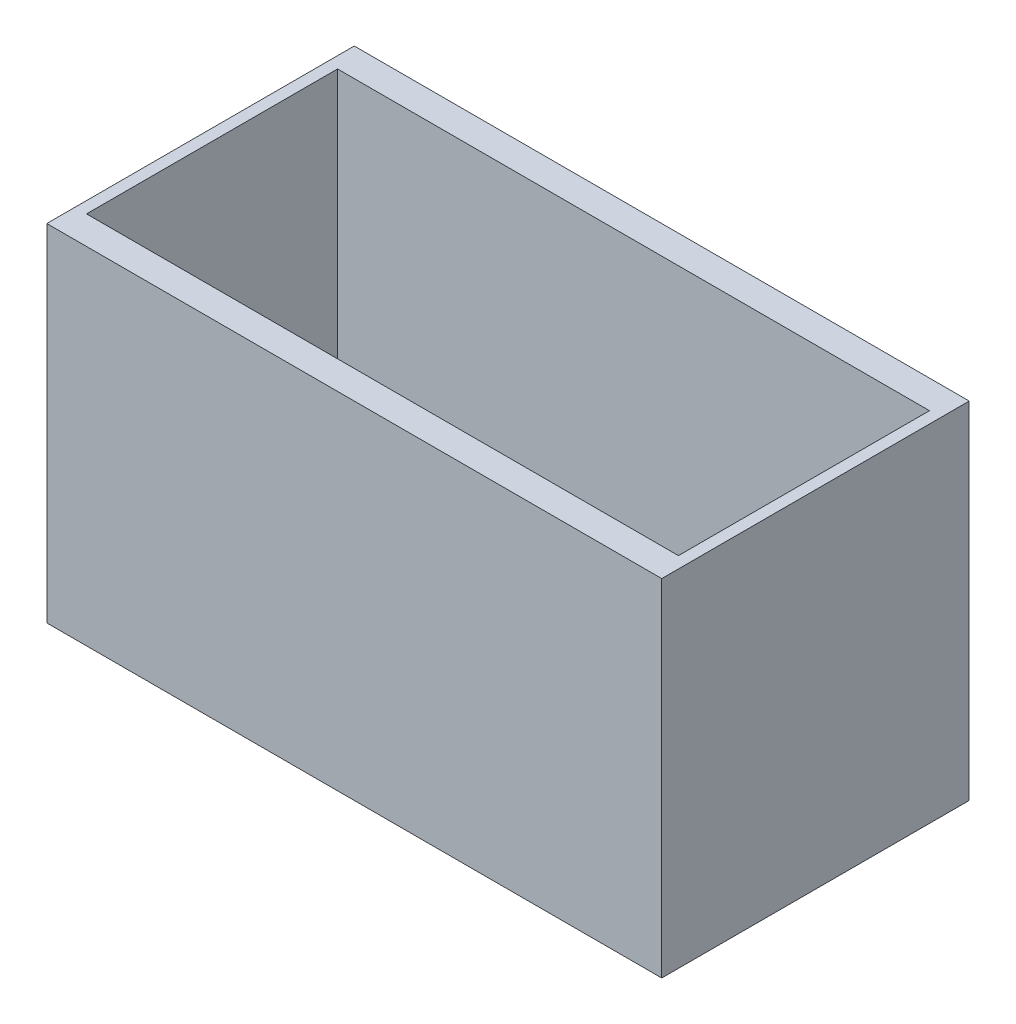
ISO-10303-21;
HEADER;
FILE_DESCRIPTION(('STEP AP214'),'2;1');
FILE_NAME('part.step','',(''),(''),'','','');
FILE_SCHEMA(('AUTOMOTIVE_DESIGN { 1 0 10303 214 1 1 1 1 }'));
ENDSEC;
DATA;
#1=APPLICATION_CONTEXT('core data for automotive mechanical design processes');
#2=APPLICATION_PROTOCOL_DEFINITION('international standard','automotive_design',2000,#1);
#3=PRODUCT_CONTEXT('',#1,'mechanical');
#4=PRODUCT('Part','Part','',(#3));
#5=PRODUCT_RELATED_PRODUCT_CATEGORY('part','',(#4));
#6=PRODUCT_DEFINITION_FORMATION('','',#4);
#7=PRODUCT_DEFINITION_CONTEXT('part definition',#1,'design');
#8=PRODUCT_DEFINITION('design','',#6,#7);
#9=PRODUCT_DEFINITION_SHAPE('','',#8);
#10=(LENGTH_UNIT() NAMED_UNIT(*) SI_UNIT(.MILLI.,.METRE.));
#11=(NAMED_UNIT(*) PLANE_ANGLE_UNIT() SI_UNIT($,.RADIAN.));
#12=(NAMED_UNIT(*) SI_UNIT($,.STERADIAN.) SOLID_ANGLE_UNIT());
#13=UNCERTAINTY_MEASURE_WITH_UNIT(LENGTH_MEASURE(1.E-05),#10,'distance_accuracy_value','');
#14=(GEOMETRIC_REPRESENTATION_CONTEXT(3) GLOBAL_UNCERTAINTY_ASSIGNED_CONTEXT((#13)) GLOBAL_UNIT_ASSIGNED_CONTEXT((#10,
#11,#12)) REPRESENTATION_CONTEXT('',''));
#15=CARTESIAN_POINT('',(0.,0.,0.));
#16=DIRECTION('',(0.,0.,1.));
#17=DIRECTION('',(1.,0.,0.));
#18=AXIS2_PLACEMENT_3D('',#15,#16,#17);
#19=CARTESIAN_POINT('',(40.,45.,20.));
#20=DIRECTION('',(-1.,0.,0.));
#21=DIRECTION('',(0.,0.,1.));
#22=AXIS2_PLACEMENT_3D('',#19,#20,#21);
#23=PLANE('',#22);
#24=DIRECTION('',(0.,0.,-1.));
#25=VECTOR('',#24,1.);
#26=CARTESIAN_POINT('',(40.,0.,20.));
#27=LINE('',#26,#25);
#28=CARTESIAN_POINT('',(40.,0.,20.));
#29=VERTEX_POINT('',#28);
#30=CARTESIAN_POINT('',(40.,0.,-20.));
#31=VERTEX_POINT('',#30);
#32=EDGE_CURVE('E162',#29,#31,#27,.T.);
#33=ORIENTED_EDGE('',*,*,#32,.T.);
#34=DIRECTION('',(0.,-1.,0.));
#35=VECTOR('',#34,1.);
#36=CARTESIAN_POINT('',(40.,45.,-20.));
#37=LINE('',#36,#35);
#38=CARTESIAN_POINT('',(40.,45.,-20.));
#39=VERTEX_POINT('',#38);
#40=EDGE_CURVE('E11',#39,#31,#37,.T.);
#41=ORIENTED_EDGE('',*,*,#40,.F.);
#42=DIRECTION('',(0.,0.,-1.));
#43=VECTOR('',#42,1.);
#44=CARTESIAN_POINT('',(40.,45.,20.));
#45=LINE('',#44,#43);
#46=CARTESIAN_POINT('',(40.,45.,20.));
#47=VERTEX_POINT('',#46);
#48=EDGE_CURVE('E168',#47,#39,#45,.T.);
#49=ORIENTED_EDGE('',*,*,#48,.F.);
#50=DIRECTION('',(0.,-1.,0.));
#51=VECTOR('',#50,1.);
#52=CARTESIAN_POINT('',(40.,45.,20.));
#53=LINE('',#52,#51);
#54=EDGE_CURVE('E178',#47,#29,#53,.T.);
#55=ORIENTED_EDGE('',*,*,#54,.T.);
#56=EDGE_LOOP('',(#33,#41,#49,#55));
#57=FACE_BOUND('',#56,.T.);
#58=ADVANCED_FACE('F43',(#57),#23,.F.);
#59=CARTESIAN_POINT('',(-40.,45.,-20.));
#60=DIRECTION('',(0.,0.,1.));
#61=DIRECTION('',(1.,0.,0.));
#62=AXIS2_PLACEMENT_3D('',#59,#60,#61);
#63=PLANE('',#62);
#64=DIRECTION('',(-1.,0.,0.));
#65=VECTOR('',#64,1.);
#66=CARTESIAN_POINT('',(-40.,0.,-20.));
#67=LINE('',#66,#65);
#68=CARTESIAN_POINT('',(-40.,0.,-20.));
#69=VERTEX_POINT('',#68);
#70=EDGE_CURVE('E182',#31,#69,#67,.T.);
#71=ORIENTED_EDGE('',*,*,#70,.T.);
#72=DIRECTION('',(0.,-1.,0.));
#73=VECTOR('',#72,1.);
#74=CARTESIAN_POINT('',(-40.,45.,-20.));
#75=LINE('',#74,#73);
#76=CARTESIAN_POINT('',(-40.,45.,-20.));
#77=VERTEX_POINT('',#76);
#78=EDGE_CURVE('E51',#77,#69,#75,.T.);
#79=ORIENTED_EDGE('',*,*,#78,.F.);
#80=DIRECTION('',(-1.,0.,0.));
#81=VECTOR('',#80,1.);
#82=CARTESIAN_POINT('',(-40.,45.,-20.));
#83=LINE('',#82,#81);
#84=EDGE_CURVE('E95',#39,#77,#83,.T.);
#85=ORIENTED_EDGE('',*,*,#84,.F.);
#86=ORIENTED_EDGE('',*,*,#40,.T.);
#87=EDGE_LOOP('',(#71,#79,#85,#86));
#88=FACE_BOUND('',#87,.T.);
#89=ADVANCED_FACE('F217',(#88),#63,.F.);
#90=CARTESIAN_POINT('',(-40.,45.,20.));
#91=DIRECTION('',(1.,0.,0.));
#92=DIRECTION('',(0.,0.,-1.));
#93=AXIS2_PLACEMENT_3D('',#90,#91,#92);
#94=PLANE('',#93);
#95=DIRECTION('',(0.,0.,1.));
#96=VECTOR('',#95,1.);
#97=CARTESIAN_POINT('',(-40.,0.,20.));
#98=LINE('',#97,#96);
#99=CARTESIAN_POINT('',(-40.,0.,20.));
#100=VERTEX_POINT('',#99);
#101=EDGE_CURVE('E185',#69,#100,#98,.T.);
#102=ORIENTED_EDGE('',*,*,#101,.T.);
#103=DIRECTION('',(0.,-1.,0.));
#104=VECTOR('',#103,1.);
#105=CARTESIAN_POINT('',(-40.,45.,20.));
#106=LINE('',#105,#104);
#107=CARTESIAN_POINT('',(-40.,45.,20.));
#108=VERTEX_POINT('',#107);
#109=EDGE_CURVE('E192',#108,#100,#106,.T.);
#110=ORIENTED_EDGE('',*,*,#109,.F.);
#111=DIRECTION('',(0.,0.,1.));
#112=VECTOR('',#111,1.);
#113=CARTESIAN_POINT('',(-40.,45.,20.));
#114=LINE('',#113,#112);
#115=EDGE_CURVE('E173',#77,#108,#114,.T.);
#116=ORIENTED_EDGE('',*,*,#115,.F.);
#117=ORIENTED_EDGE('',*,*,#78,.T.);
#118=EDGE_LOOP('',(#102,#110,#116,#117));
#119=FACE_BOUND('',#118,.T.);
#120=ADVANCED_FACE('F199',(#119),#94,.F.);
#121=CARTESIAN_POINT('',(-40.,45.,20.));
#122=DIRECTION('',(0.,0.,-1.));
#123=DIRECTION('',(-1.,0.,0.));
#124=AXIS2_PLACEMENT_3D('',#121,#122,#123);
#125=PLANE('',#124);
#126=DIRECTION('',(1.,0.,0.));
#127=VECTOR('',#126,1.);
#128=CARTESIAN_POINT('',(-40.,0.,20.));
#129=LINE('',#128,#127);
#130=EDGE_CURVE('E88',#100,#29,#129,.T.);
#131=ORIENTED_EDGE('',*,*,#130,.T.);
#132=ORIENTED_EDGE('',*,*,#54,.F.);
#133=DIRECTION('',(1.,0.,0.));
#134=VECTOR('',#133,1.);
#135=CARTESIAN_POINT('',(-40.,45.,20.));
#136=LINE('',#135,#134);
#137=EDGE_CURVE('E67',#108,#47,#136,.T.);
#138=ORIENTED_EDGE('',*,*,#137,.F.);
#139=ORIENTED_EDGE('',*,*,#109,.T.);
#140=EDGE_LOOP('',(#131,#132,#138,#139));
#141=FACE_BOUND('',#140,.T.);
#142=ADVANCED_FACE('F207',(#141),#125,.F.);
#143=CARTESIAN_POINT('',(0.,45.,0.));
#144=DIRECTION('',(0.,-1.,0.));
#145=DIRECTION('',(0.,0.,-1.));
#146=AXIS2_PLACEMENT_3D('',#143,#144,#145);
#147=PLANE('',#146);
#148=DIRECTION('',(-1.,0.,0.));
#149=VECTOR('',#148,1.);
#150=CARTESIAN_POINT('',(-38.5,45.,-16.328647367154));
#151=LINE('',#150,#149);
#152=CARTESIAN_POINT('',(38.5,45.,-16.328647367154));
#153=VERTEX_POINT('',#152);
#154=CARTESIAN_POINT('',(-38.5,45.,-16.328647367154));
#155=VERTEX_POINT('',#154);
#156=EDGE_CURVE('E153',#153,#155,#151,.T.);
#157=ORIENTED_EDGE('',*,*,#156,.F.);
#158=DIRECTION('',(0.,0.,-1.));
#159=VECTOR('',#158,1.);
#160=CARTESIAN_POINT('',(38.5,45.,16.328647367154));
#161=LINE('',#160,#159);
#162=CARTESIAN_POINT('',(38.5,45.,16.328647367154));
#163=VERTEX_POINT('',#162);
#164=EDGE_CURVE('E58',#163,#153,#161,.T.);
#165=ORIENTED_EDGE('',*,*,#164,.F.);
#166=DIRECTION('',(1.,0.,0.));
#167=VECTOR('',#166,1.);
#168=CARTESIAN_POINT('',(-38.5,45.,16.328647367154));
#169=LINE('',#168,#167);
#170=CARTESIAN_POINT('',(-38.5,45.,16.328647367154));
#171=VERTEX_POINT('',#170);
#172=EDGE_CURVE('E140',#171,#163,#169,.T.);
#173=ORIENTED_EDGE('',*,*,#172,.F.);
#174=DIRECTION('',(0.,0.,1.));
#175=VECTOR('',#174,1.);
#176=CARTESIAN_POINT('',(-38.5,45.,16.328647367154));
#177=LINE('',#176,#175);
#178=EDGE_CURVE('E144',#155,#171,#177,.T.);
#179=ORIENTED_EDGE('',*,*,#178,.F.);
#180=EDGE_LOOP('',(#157,#165,#173,#179));
#181=FACE_BOUND('',#180,.T.);
#182=ORIENTED_EDGE('',*,*,#48,.T.);
#183=ORIENTED_EDGE('',*,*,#84,.T.);
#184=ORIENTED_EDGE('',*,*,#115,.T.);
#185=ORIENTED_EDGE('',*,*,#137,.T.);
#186=EDGE_LOOP('',(#182,#183,#184,#185));
#187=FACE_BOUND('',#186,.T.);
#188=ADVANCED_FACE('F209',(#181,#187),#147,.F.);
#189=CARTESIAN_POINT('',(0.,0.,0.));
#190=DIRECTION('',(0.,-1.,0.));
#191=DIRECTION('',(0.,0.,-1.));
#192=AXIS2_PLACEMENT_3D('',#189,#190,#191);
#193=PLANE('',#192);
#194=ORIENTED_EDGE('',*,*,#32,.F.);
#195=ORIENTED_EDGE('',*,*,#130,.F.);
#196=ORIENTED_EDGE('',*,*,#101,.F.);
#197=ORIENTED_EDGE('',*,*,#70,.F.);
#198=EDGE_LOOP('',(#194,#195,#196,#197));
#199=FACE_BOUND('',#198,.T.);
#200=ADVANCED_FACE('F203',(#199),#193,.T.);
#201=CARTESIAN_POINT('',(38.5,1.,16.328647367154));
#202=DIRECTION('',(1.,0.,0.));
#203=DIRECTION('',(0.,0.,-1.));
#204=AXIS2_PLACEMENT_3D('',#201,#202,#203);
#205=PLANE('',#204);
#206=ORIENTED_EDGE('',*,*,#164,.T.);
#207=DIRECTION('',(0.,1.,0.));
#208=VECTOR('',#207,1.);
#209=CARTESIAN_POINT('',(38.5,1.,-16.328647367154));
#210=LINE('',#209,#208);
#211=CARTESIAN_POINT('',(38.5,1.,-16.328647367154));
#212=VERTEX_POINT('',#211);
#213=EDGE_CURVE('E115',#212,#153,#210,.T.);
#214=ORIENTED_EDGE('',*,*,#213,.F.);
#215=DIRECTION('',(0.,0.,-1.));
#216=VECTOR('',#215,1.);
#217=CARTESIAN_POINT('',(38.5,1.,16.328647367154));
#218=LINE('',#217,#216);
#219=CARTESIAN_POINT('',(38.5,1.,16.328647367154));
#220=VERTEX_POINT('',#219);
#221=EDGE_CURVE('E119',#220,#212,#218,.T.);
#222=ORIENTED_EDGE('',*,*,#221,.F.);
#223=DIRECTION('',(0.,1.,0.));
#224=VECTOR('',#223,1.);
#225=CARTESIAN_POINT('',(38.5,1.,16.328647367154));
#226=LINE('',#225,#224);
#227=EDGE_CURVE('E159',#220,#163,#226,.T.);
#228=ORIENTED_EDGE('',*,*,#227,.T.);
#229=EDGE_LOOP('',(#206,#214,#222,#228));
#230=FACE_BOUND('',#229,.T.);
#231=ADVANCED_FACE('F117',(#230),#205,.F.);
#232=CARTESIAN_POINT('',(-38.5,1.,16.328647367154));
#233=DIRECTION('',(0.,0.,1.));
#234=DIRECTION('',(1.,0.,0.));
#235=AXIS2_PLACEMENT_3D('',#232,#233,#234);
#236=PLANE('',#235);
#237=ORIENTED_EDGE('',*,*,#172,.T.);
#238=ORIENTED_EDGE('',*,*,#227,.F.);
#239=DIRECTION('',(1.,0.,0.));
#240=VECTOR('',#239,1.);
#241=CARTESIAN_POINT('',(-38.5,1.,16.328647367154));
#242=LINE('',#241,#240);
#243=CARTESIAN_POINT('',(-38.5,1.,16.328647367154));
#244=VERTEX_POINT('',#243);
#245=EDGE_CURVE('E126',#244,#220,#242,.T.);
#246=ORIENTED_EDGE('',*,*,#245,.F.);
#247=DIRECTION('',(0.,1.,0.));
#248=VECTOR('',#247,1.);
#249=CARTESIAN_POINT('',(-38.5,1.,16.328647367154));
#250=LINE('',#249,#248);
#251=EDGE_CURVE('E163',#244,#171,#250,.T.);
#252=ORIENTED_EDGE('',*,*,#251,.T.);
#253=EDGE_LOOP('',(#237,#238,#246,#252));
#254=FACE_BOUND('',#253,.T.);
#255=ADVANCED_FACE('F260',(#254),#236,.F.);
#256=CARTESIAN_POINT('',(-38.5,1.,16.328647367154));
#257=DIRECTION('',(-1.,0.,0.));
#258=DIRECTION('',(0.,0.,1.));
#259=AXIS2_PLACEMENT_3D('',#256,#257,#258);
#260=PLANE('',#259);
#261=ORIENTED_EDGE('',*,*,#178,.T.);
#262=ORIENTED_EDGE('',*,*,#251,.F.);
#263=DIRECTION('',(0.,0.,1.));
#264=VECTOR('',#263,1.);
#265=CARTESIAN_POINT('',(-38.5,1.,16.328647367154));
#266=LINE('',#265,#264);
#267=CARTESIAN_POINT('',(-38.5,1.,-16.328647367154));
#268=VERTEX_POINT('',#267);
#269=EDGE_CURVE('E135',#268,#244,#266,.T.);
#270=ORIENTED_EDGE('',*,*,#269,.F.);
#271=DIRECTION('',(0.,1.,0.));
#272=VECTOR('',#271,1.);
#273=CARTESIAN_POINT('',(-38.5,1.,-16.328647367154));
#274=LINE('',#273,#272);
#275=EDGE_CURVE('E125',#268,#155,#274,.T.);
#276=ORIENTED_EDGE('',*,*,#275,.T.);
#277=EDGE_LOOP('',(#261,#262,#270,#276));
#278=FACE_BOUND('',#277,.T.);
#279=ADVANCED_FACE('F270',(#278),#260,.F.);
#280=CARTESIAN_POINT('',(-38.5,1.,-16.328647367154));
#281=DIRECTION('',(0.,0.,-1.));
#282=DIRECTION('',(-1.,0.,0.));
#283=AXIS2_PLACEMENT_3D('',#280,#281,#282);
#284=PLANE('',#283);
#285=ORIENTED_EDGE('',*,*,#156,.T.);
#286=ORIENTED_EDGE('',*,*,#275,.F.);
#287=DIRECTION('',(-1.,0.,0.));
#288=VECTOR('',#287,1.);
#289=CARTESIAN_POINT('',(-38.5,1.,-16.328647367154));
#290=LINE('',#289,#288);
#291=EDGE_CURVE('E129',#212,#268,#290,.T.);
#292=ORIENTED_EDGE('',*,*,#291,.F.);
#293=ORIENTED_EDGE('',*,*,#213,.T.);
#294=EDGE_LOOP('',(#285,#286,#292,#293));
#295=FACE_BOUND('',#294,.T.);
#296=ADVANCED_FACE('F130',(#295),#284,.F.);
#297=CARTESIAN_POINT('',(0.,1.,0.));
#298=DIRECTION('',(0.,-1.,0.));
#299=DIRECTION('',(0.,0.,-1.));
#300=AXIS2_PLACEMENT_3D('',#297,#298,#299);
#301=PLANE('',#300);
#302=ORIENTED_EDGE('',*,*,#221,.T.);
#303=ORIENTED_EDGE('',*,*,#291,.T.);
#304=ORIENTED_EDGE('',*,*,#269,.T.);
#305=ORIENTED_EDGE('',*,*,#245,.T.);
#306=EDGE_LOOP('',(#302,#303,#304,#305));
#307=FACE_BOUND('',#306,.T.);
#308=ADVANCED_FACE('F137',(#307),#301,.F.);
#309=CLOSED_SHELL('',(#58,#89,#120,#142,#188,#200,#231,#255,#279,#296,#308));
#310=MANIFOLD_SOLID_BREP('B2',#309);
#311=ADVANCED_BREP_SHAPE_REPRESENTATION('',(#18,#310),#14);
#312=SHAPE_DEFINITION_REPRESENTATION(#9,#311);
ENDSEC;
END-ISO-10303-21;
